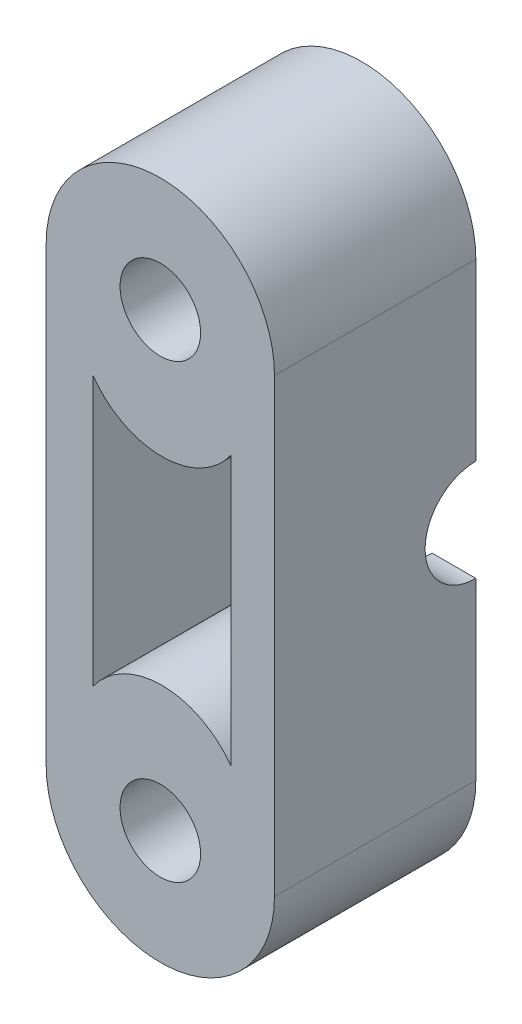
ISO-10303-21;
HEADER;
FILE_DESCRIPTION(('STEP AP214'),'2;1');
FILE_NAME('part.step','',(''),(''),'','','');
FILE_SCHEMA(('AUTOMOTIVE_DESIGN { 1 0 10303 214 1 1 1 1 }'));
ENDSEC;
DATA;
#1=APPLICATION_CONTEXT('core data for automotive mechanical design processes');
#2=APPLICATION_PROTOCOL_DEFINITION('international standard','automotive_design',2000,#1);
#3=PRODUCT_CONTEXT('',#1,'mechanical');
#4=PRODUCT('Part','Part','',(#3));
#5=PRODUCT_RELATED_PRODUCT_CATEGORY('part','',(#4));
#6=PRODUCT_DEFINITION_FORMATION('','',#4);
#7=PRODUCT_DEFINITION_CONTEXT('part definition',#1,'design');
#8=PRODUCT_DEFINITION('design','',#6,#7);
#9=PRODUCT_DEFINITION_SHAPE('','',#8);
#10=(LENGTH_UNIT() NAMED_UNIT(*) SI_UNIT(.MILLI.,.METRE.));
#11=(NAMED_UNIT(*) PLANE_ANGLE_UNIT() SI_UNIT($,.RADIAN.));
#12=(NAMED_UNIT(*) SI_UNIT($,.STERADIAN.) SOLID_ANGLE_UNIT());
#13=UNCERTAINTY_MEASURE_WITH_UNIT(LENGTH_MEASURE(1.E-05),#10,'distance_accuracy_value','');
#14=(GEOMETRIC_REPRESENTATION_CONTEXT(3) GLOBAL_UNCERTAINTY_ASSIGNED_CONTEXT((#13)) GLOBAL_UNIT_ASSIGNED_CONTEXT((#10,
#11,#12)) REPRESENTATION_CONTEXT('',''));
#15=CARTESIAN_POINT('',(0.,0.,0.));
#16=DIRECTION('',(0.,0.,1.));
#17=DIRECTION('',(1.,0.,0.));
#18=AXIS2_PLACEMENT_3D('',#15,#16,#17);
#19=CARTESIAN_POINT('',(-27.3715807741558,59.91651768647,5.));
#20=DIRECTION('',(0.,0.,-1.));
#21=DIRECTION('',(-1.,0.,0.));
#22=AXIS2_PLACEMENT_3D('',#19,#20,#21);
#23=CYLINDRICAL_SURFACE('',#22,1.);
#24=CARTESIAN_POINT('',(-27.3715807741558,59.91651768647,5.));
#25=DIRECTION('',(0.,0.,1.));
#26=DIRECTION('',(1.,0.,0.));
#27=AXIS2_PLACEMENT_3D('',#24,#25,#26);
#28=CIRCLE('',#27,1.);
#29=CARTESIAN_POINT('',(-26.3715807741558,59.91651768647,5.));
#30=VERTEX_POINT('',#29);
#31=EDGE_CURVE('E224',#30,#30,#28,.T.);
#32=ORIENTED_EDGE('',*,*,#31,.T.);
#33=EDGE_LOOP('',(#32));
#34=FACE_BOUND('',#33,.T.);
#35=CARTESIAN_POINT('',(-27.3715807741558,59.91651768647,3.));
#36=DIRECTION('',(0.,0.,-1.));
#37=DIRECTION('',(-1.,0.,0.));
#38=AXIS2_PLACEMENT_3D('',#35,#36,#37);
#39=CIRCLE('',#38,1.);
#40=CARTESIAN_POINT('',(-28.3715807741558,59.91651768647,3.));
#41=VERTEX_POINT('',#40);
#42=EDGE_CURVE('E37',#41,#41,#39,.T.);
#43=ORIENTED_EDGE('',*,*,#42,.T.);
#44=EDGE_LOOP('',(#43));
#45=FACE_BOUND('',#44,.T.);
#46=ADVANCED_FACE('F33',(#34,#45),#23,.F.);
#47=CARTESIAN_POINT('',(-27.3715807741558,71.1202505677841,5.));
#48=DIRECTION('',(0.,0.,-1.));
#49=DIRECTION('',(-1.,0.,0.));
#50=AXIS2_PLACEMENT_3D('',#47,#48,#49);
#51=CYLINDRICAL_SURFACE('',#50,1.00000000000001);
#52=CARTESIAN_POINT('',(-27.3715807741558,71.1202505677841,5.));
#53=DIRECTION('',(0.,0.,1.));
#54=DIRECTION('',(1.,0.,0.));
#55=AXIS2_PLACEMENT_3D('',#52,#53,#54);
#56=CIRCLE('',#55,1.00000000000001);
#57=CARTESIAN_POINT('',(-26.3715807741558,71.1202505677841,5.));
#58=VERTEX_POINT('',#57);
#59=EDGE_CURVE('E221',#58,#58,#56,.T.);
#60=ORIENTED_EDGE('',*,*,#59,.T.);
#61=EDGE_LOOP('',(#60));
#62=FACE_BOUND('',#61,.T.);
#63=CARTESIAN_POINT('',(-27.3715807741558,71.1202505677841,3.));
#64=DIRECTION('',(0.,0.,-1.));
#65=DIRECTION('',(-1.,0.,0.));
#66=AXIS2_PLACEMENT_3D('',#63,#64,#65);
#67=CIRCLE('',#66,1.00000000000001);
#68=CARTESIAN_POINT('',(-28.3715807741558,71.1202505677841,3.));
#69=VERTEX_POINT('',#68);
#70=EDGE_CURVE('E138',#69,#69,#67,.T.);
#71=ORIENTED_EDGE('',*,*,#70,.T.);
#72=EDGE_LOOP('',(#71));
#73=FACE_BOUND('',#72,.T.);
#74=ADVANCED_FACE('F275',(#62,#73),#51,.F.);
#75=CARTESIAN_POINT('',(-27.3715807741558,71.1202505677841,0.));
#76=DIRECTION('',(0.,0.,1.));
#77=DIRECTION('',(1.,0.,0.));
#78=AXIS2_PLACEMENT_3D('',#75,#76,#77);
#79=PLANE('',#78);
#80=CARTESIAN_POINT('',(-27.3715807741558,59.91651768647,0.));
#81=DIRECTION('',(0.,0.,-1.));
#82=DIRECTION('',(-1.,0.,0.));
#83=AXIS2_PLACEMENT_3D('',#80,#81,#82);
#84=CIRCLE('',#83,2.);
#85=CARTESIAN_POINT('',(-29.3715807741558,59.91651768647,0.));
#86=VERTEX_POINT('',#85);
#87=EDGE_CURVE('E282',#86,#86,#84,.T.);
#88=ORIENTED_EDGE('',*,*,#87,.F.);
#89=EDGE_LOOP('',(#88));
#90=FACE_BOUND('',#89,.T.);
#91=DIRECTION('',(0.,-1.,0.));
#92=VECTOR('',#91,1.);
#93=CARTESIAN_POINT('',(-30.2061787940453,71.1202505677841,0.));
#94=LINE('',#93,#92);
#95=CARTESIAN_POINT('',(-30.2061787940453,64.2584232711498,0.));
#96=VERTEX_POINT('',#95);
#97=CARTESIAN_POINT('',(-30.2061787940453,59.91651768647,0.));
#98=VERTEX_POINT('',#97);
#99=EDGE_CURVE('E227',#96,#98,#94,.T.);
#100=ORIENTED_EDGE('',*,*,#99,.F.);
#101=DIRECTION('',(1.,0.,0.));
#102=VECTOR('',#101,1.);
#103=CARTESIAN_POINT('',(-39.5369827542663,64.2584232711498,0.));
#104=LINE('',#103,#102);
#105=CARTESIAN_POINT('',(-29.0388809266111,64.2584232711498,0.));
#106=VERTEX_POINT('',#105);
#107=EDGE_CURVE('E182',#96,#106,#104,.T.);
#108=ORIENTED_EDGE('',*,*,#107,.T.);
#109=DIRECTION('',(0.,-1.,0.));
#110=VECTOR('',#109,1.);
#111=CARTESIAN_POINT('',(-29.0388809266111,68.8624014161277,0.));
#112=LINE('',#111,#110);
#113=CARTESIAN_POINT('',(-29.0388809266111,62.1904899484629,0.));
#114=VERTEX_POINT('',#113);
#115=EDGE_CURVE('E190',#106,#114,#112,.T.);
#116=ORIENTED_EDGE('',*,*,#115,.T.);
#117=CARTESIAN_POINT('',(-27.3302206726969,60.9530673439399,0.));
#118=DIRECTION('',(0.,0.,-1.));
#119=DIRECTION('',(-1.,0.,0.));
#120=AXIS2_PLACEMENT_3D('',#117,#118,#119);
#121=CIRCLE('',#120,2.1096764125075);
#122=CARTESIAN_POINT('',(-25.6215604187827,62.1904899484629,0.));
#123=VERTEX_POINT('',#122);
#124=EDGE_CURVE('E194',#114,#123,#121,.T.);
#125=ORIENTED_EDGE('',*,*,#124,.T.);
#126=DIRECTION('',(0.,1.,0.));
#127=VECTOR('',#126,1.);
#128=CARTESIAN_POINT('',(-25.6215604187827,68.8624014161277,0.));
#129=LINE('',#128,#127);
#130=CARTESIAN_POINT('',(-25.6215604187827,64.2584232711498,0.));
#131=VERTEX_POINT('',#130);
#132=EDGE_CURVE('E198',#123,#131,#129,.T.);
#133=ORIENTED_EDGE('',*,*,#132,.T.);
#134=CARTESIAN_POINT('',(-24.5369827542663,64.2584232711498,0.));
#135=VERTEX_POINT('',#134);
#136=EDGE_CURVE('E57',#131,#135,#104,.T.);
#137=ORIENTED_EDGE('',*,*,#136,.T.);
#138=DIRECTION('',(0.,1.,0.));
#139=VECTOR('',#138,1.);
#140=CARTESIAN_POINT('',(-24.5369827542663,71.1202505677841,0.));
#141=LINE('',#140,#139);
#142=CARTESIAN_POINT('',(-24.5369827542663,59.91651768647,0.));
#143=VERTEX_POINT('',#142);
#144=EDGE_CURVE('E137',#143,#135,#141,.T.);
#145=ORIENTED_EDGE('',*,*,#144,.F.);
#146=CARTESIAN_POINT('',(-27.3715807741558,59.91651768647,0.));
#147=DIRECTION('',(0.,0.,1.));
#148=DIRECTION('',(1.,0.,0.));
#149=AXIS2_PLACEMENT_3D('',#146,#147,#148);
#150=CIRCLE('',#149,2.83459801988952);
#151=EDGE_CURVE('E144',#98,#143,#150,.T.);
#152=ORIENTED_EDGE('',*,*,#151,.F.);
#153=EDGE_LOOP('',(#100,#108,#116,#125,#133,#137,#145,#152));
#154=FACE_BOUND('',#153,.T.);
#155=ADVANCED_FACE('F240',(#90,#154),#79,.F.);
#156=CARTESIAN_POINT('',(-27.3715807741558,71.1202505677841,5.));
#157=DIRECTION('',(0.,0.,1.));
#158=DIRECTION('',(1.,0.,0.));
#159=AXIS2_PLACEMENT_3D('',#156,#157,#158);
#160=PLANE('',#159);
#161=ORIENTED_EDGE('',*,*,#59,.F.);
#162=EDGE_LOOP('',(#161));
#163=FACE_BOUND('',#162,.T.);
#164=CARTESIAN_POINT('',(-27.3715807741558,71.1202505677841,5.));
#165=DIRECTION('',(0.,0.,1.));
#166=DIRECTION('',(1.,0.,0.));
#167=AXIS2_PLACEMENT_3D('',#164,#165,#166);
#168=CIRCLE('',#167,2.83459801988952);
#169=CARTESIAN_POINT('',(-24.5369827542663,71.1202505677841,5.));
#170=VERTEX_POINT('',#169);
#171=CARTESIAN_POINT('',(-30.2061787940453,71.1202505677841,5.));
#172=VERTEX_POINT('',#171);
#173=EDGE_CURVE('E146',#170,#172,#168,.T.);
#174=ORIENTED_EDGE('',*,*,#173,.T.);
#175=DIRECTION('',(0.,-1.,0.));
#176=VECTOR('',#175,1.);
#177=CARTESIAN_POINT('',(-30.2061787940453,71.1202505677841,5.));
#178=LINE('',#177,#176);
#179=CARTESIAN_POINT('',(-30.2061787940453,59.91651768647,5.));
#180=VERTEX_POINT('',#179);
#181=EDGE_CURVE('E153',#172,#180,#178,.T.);
#182=ORIENTED_EDGE('',*,*,#181,.T.);
#183=CARTESIAN_POINT('',(-27.3715807741558,59.91651768647,5.));
#184=DIRECTION('',(0.,0.,1.));
#185=DIRECTION('',(1.,0.,0.));
#186=AXIS2_PLACEMENT_3D('',#183,#184,#185);
#187=CIRCLE('',#186,2.83459801988952);
#188=CARTESIAN_POINT('',(-24.5369827542663,59.91651768647,5.));
#189=VERTEX_POINT('',#188);
#190=EDGE_CURVE('E155',#180,#189,#187,.T.);
#191=ORIENTED_EDGE('',*,*,#190,.T.);
#192=DIRECTION('',(0.,1.,0.));
#193=VECTOR('',#192,1.);
#194=CARTESIAN_POINT('',(-24.5369827542663,71.1202505677841,5.));
#195=LINE('',#194,#193);
#196=EDGE_CURVE('E157',#189,#170,#195,.T.);
#197=ORIENTED_EDGE('',*,*,#196,.T.);
#198=EDGE_LOOP('',(#174,#182,#191,#197));
#199=FACE_BOUND('',#198,.T.);
#200=ORIENTED_EDGE('',*,*,#31,.F.);
#201=EDGE_LOOP('',(#200));
#202=FACE_BOUND('',#201,.T.);
#203=DIRECTION('',(0.,-1.,0.));
#204=VECTOR('',#203,1.);
#205=CARTESIAN_POINT('',(-29.0388809266111,68.8624014161277,5.));
#206=LINE('',#205,#204);
#207=CARTESIAN_POINT('',(-29.0388809266111,68.8624014161277,5.));
#208=VERTEX_POINT('',#207);
#209=CARTESIAN_POINT('',(-29.0388809266111,62.1904899484629,5.));
#210=VERTEX_POINT('',#209);
#211=EDGE_CURVE('E203',#208,#210,#206,.T.);
#212=ORIENTED_EDGE('',*,*,#211,.F.);
#213=CARTESIAN_POINT('',(-27.3302206726969,70.0760926282352,5.));
#214=DIRECTION('',(0.,0.,-1.));
#215=DIRECTION('',(1.,0.,0.));
#216=AXIS2_PLACEMENT_3D('',#213,#214,#215);
#217=CIRCLE('',#216,2.09584498989144);
#218=CARTESIAN_POINT('',(-25.6215604187827,68.8624014161277,5.));
#219=VERTEX_POINT('',#218);
#220=EDGE_CURVE('E201',#219,#208,#217,.T.);
#221=ORIENTED_EDGE('',*,*,#220,.F.);
#222=DIRECTION('',(0.,1.,0.));
#223=VECTOR('',#222,1.);
#224=CARTESIAN_POINT('',(-25.6215604187827,68.8624014161277,5.));
#225=LINE('',#224,#223);
#226=CARTESIAN_POINT('',(-25.6215604187827,62.1904899484629,5.));
#227=VERTEX_POINT('',#226);
#228=EDGE_CURVE('E208',#227,#219,#225,.T.);
#229=ORIENTED_EDGE('',*,*,#228,.F.);
#230=CARTESIAN_POINT('',(-27.3302206726969,60.9530673439399,5.));
#231=DIRECTION('',(0.,0.,-1.));
#232=DIRECTION('',(-1.,0.,0.));
#233=AXIS2_PLACEMENT_3D('',#230,#231,#232);
#234=CIRCLE('',#233,2.1096764125075);
#235=EDGE_CURVE('E205',#210,#227,#234,.T.);
#236=ORIENTED_EDGE('',*,*,#235,.F.);
#237=EDGE_LOOP('',(#212,#221,#229,#236));
#238=FACE_BOUND('',#237,.T.);
#239=ADVANCED_FACE('F257',(#163,#199,#202,#238),#160,.T.);
#240=CARTESIAN_POINT('',(-27.3715807741558,71.1202505677829,0.));
#241=DIRECTION('',(0.,0.,-1.));
#242=DIRECTION('',(-1.,0.,0.));
#243=AXIS2_PLACEMENT_3D('',#240,#241,#242);
#244=CIRCLE('',#243,2.);
#245=CARTESIAN_POINT('',(-29.3715807741559,71.1202505677829,0.));
#246=VERTEX_POINT('',#245);
#247=EDGE_CURVE('E172',#246,#246,#244,.T.);
#248=ORIENTED_EDGE('',*,*,#247,.F.);
#249=EDGE_LOOP('',(#248));
#250=FACE_BOUND('',#249,.T.);
#251=CARTESIAN_POINT('',(-24.5369827542663,66.7783449831043,0.));
#252=VERTEX_POINT('',#251);
#253=CARTESIAN_POINT('',(-24.5369827542663,71.1202505677841,0.));
#254=VERTEX_POINT('',#253);
#255=EDGE_CURVE('E133',#252,#254,#141,.T.);
#256=ORIENTED_EDGE('',*,*,#255,.F.);
#257=DIRECTION('',(1.,0.,0.));
#258=VECTOR('',#257,1.);
#259=CARTESIAN_POINT('',(-39.5369827542663,66.7783449831043,0.));
#260=LINE('',#259,#258);
#261=CARTESIAN_POINT('',(-25.6215604187827,66.7783449831043,0.));
#262=VERTEX_POINT('',#261);
#263=EDGE_CURVE('E121',#252,#262,#260,.F.);
#264=ORIENTED_EDGE('',*,*,#263,.T.);
#265=CARTESIAN_POINT('',(-25.6215604187827,68.8624014161277,0.));
#266=VERTEX_POINT('',#265);
#267=EDGE_CURVE('E197',#262,#266,#129,.T.);
#268=ORIENTED_EDGE('',*,*,#267,.T.);
#269=CARTESIAN_POINT('',(-27.3302206726969,70.0760926282352,0.));
#270=DIRECTION('',(0.,0.,-1.));
#271=DIRECTION('',(1.,0.,0.));
#272=AXIS2_PLACEMENT_3D('',#269,#270,#271);
#273=CIRCLE('',#272,2.09584498989144);
#274=CARTESIAN_POINT('',(-29.0388809266111,68.8624014161277,0.));
#275=VERTEX_POINT('',#274);
#276=EDGE_CURVE('E187',#266,#275,#273,.T.);
#277=ORIENTED_EDGE('',*,*,#276,.T.);
#278=CARTESIAN_POINT('',(-29.0388809266111,66.7783449831043,0.));
#279=VERTEX_POINT('',#278);
#280=EDGE_CURVE('E191',#275,#279,#112,.T.);
#281=ORIENTED_EDGE('',*,*,#280,.T.);
#282=CARTESIAN_POINT('',(-30.2061787940453,66.7783449831043,0.));
#283=VERTEX_POINT('',#282);
#284=EDGE_CURVE('E50',#279,#283,#260,.F.);
#285=ORIENTED_EDGE('',*,*,#284,.T.);
#286=CARTESIAN_POINT('',(-30.2061787940453,71.1202505677841,0.));
#287=VERTEX_POINT('',#286);
#288=EDGE_CURVE('E147',#287,#283,#94,.T.);
#289=ORIENTED_EDGE('',*,*,#288,.F.);
#290=CARTESIAN_POINT('',(-27.3715807741558,71.1202505677841,0.));
#291=DIRECTION('',(0.,0.,1.));
#292=DIRECTION('',(1.,0.,0.));
#293=AXIS2_PLACEMENT_3D('',#290,#291,#292);
#294=CIRCLE('',#293,2.83459801988952);
#295=EDGE_CURVE('E143',#254,#287,#294,.T.);
#296=ORIENTED_EDGE('',*,*,#295,.F.);
#297=EDGE_LOOP('',(#256,#264,#268,#277,#281,#285,#289,#296));
#298=FACE_BOUND('',#297,.T.);
#299=ADVANCED_FACE('F141',(#250,#298),#79,.F.);
#300=CARTESIAN_POINT('',(-27.3715807741558,71.1202505677841,5.));
#301=DIRECTION('',(0.,0.,-1.));
#302=DIRECTION('',(-1.,0.,0.));
#303=AXIS2_PLACEMENT_3D('',#300,#301,#302);
#304=CYLINDRICAL_SURFACE('',#303,2.83459801988952);
#305=ORIENTED_EDGE('',*,*,#295,.T.);
#306=DIRECTION('',(0.,0.,-1.));
#307=VECTOR('',#306,1.);
#308=CARTESIAN_POINT('',(-30.2061787940453,71.1202505677841,5.));
#309=LINE('',#308,#307);
#310=EDGE_CURVE('E42',#172,#287,#309,.T.);
#311=ORIENTED_EDGE('',*,*,#310,.F.);
#312=ORIENTED_EDGE('',*,*,#173,.F.);
#313=DIRECTION('',(0.,0.,-1.));
#314=VECTOR('',#313,1.);
#315=CARTESIAN_POINT('',(-24.5369827542663,71.1202505677841,5.));
#316=LINE('',#315,#314);
#317=EDGE_CURVE('E159',#170,#254,#316,.T.);
#318=ORIENTED_EDGE('',*,*,#317,.T.);
#319=EDGE_LOOP('',(#305,#311,#312,#318));
#320=FACE_BOUND('',#319,.T.);
#321=ADVANCED_FACE('F35',(#320),#304,.T.);
#322=CARTESIAN_POINT('',(-30.2061787940453,71.1202505677841,5.));
#323=DIRECTION('',(1.,0.,0.));
#324=DIRECTION('',(0.,0.,-1.));
#325=AXIS2_PLACEMENT_3D('',#322,#323,#324);
#326=PLANE('',#325);
#327=ORIENTED_EDGE('',*,*,#288,.T.);
#328=CARTESIAN_POINT('',(-30.2061787940453,65.5183841271271,0.));
#329=DIRECTION('',(1.,0.,0.));
#330=DIRECTION('',(0.,0.,-1.));
#331=AXIS2_PLACEMENT_3D('',#328,#329,#330);
#332=CIRCLE('',#331,1.25996085597728);
#333=EDGE_CURVE('E184',#283,#96,#332,.T.);
#334=ORIENTED_EDGE('',*,*,#333,.T.);
#335=ORIENTED_EDGE('',*,*,#99,.T.);
#336=DIRECTION('',(0.,0.,-1.));
#337=VECTOR('',#336,1.);
#338=CARTESIAN_POINT('',(-30.2061787940453,59.91651768647,5.));
#339=LINE('',#338,#337);
#340=EDGE_CURVE('E163',#180,#98,#339,.T.);
#341=ORIENTED_EDGE('',*,*,#340,.F.);
#342=ORIENTED_EDGE('',*,*,#181,.F.);
#343=ORIENTED_EDGE('',*,*,#310,.T.);
#344=EDGE_LOOP('',(#327,#334,#335,#341,#342,#343));
#345=FACE_BOUND('',#344,.T.);
#346=ADVANCED_FACE('F232',(#345),#326,.F.);
#347=CARTESIAN_POINT('',(-27.3715807741558,59.91651768647,5.));
#348=DIRECTION('',(0.,0.,-1.));
#349=DIRECTION('',(-1.,0.,0.));
#350=AXIS2_PLACEMENT_3D('',#347,#348,#349);
#351=CYLINDRICAL_SURFACE('',#350,2.83459801988952);
#352=ORIENTED_EDGE('',*,*,#151,.T.);
#353=DIRECTION('',(0.,0.,-1.));
#354=VECTOR('',#353,1.);
#355=CARTESIAN_POINT('',(-24.5369827542663,59.91651768647,5.));
#356=LINE('',#355,#354);
#357=EDGE_CURVE('E161',#189,#143,#356,.T.);
#358=ORIENTED_EDGE('',*,*,#357,.F.);
#359=ORIENTED_EDGE('',*,*,#190,.F.);
#360=ORIENTED_EDGE('',*,*,#340,.T.);
#361=EDGE_LOOP('',(#352,#358,#359,#360));
#362=FACE_BOUND('',#361,.T.);
#363=ADVANCED_FACE('F238',(#362),#351,.T.);
#364=CARTESIAN_POINT('',(-24.5369827542663,71.1202505677841,5.));
#365=DIRECTION('',(-1.,0.,0.));
#366=DIRECTION('',(0.,0.,1.));
#367=AXIS2_PLACEMENT_3D('',#364,#365,#366);
#368=PLANE('',#367);
#369=ORIENTED_EDGE('',*,*,#144,.T.);
#370=CARTESIAN_POINT('',(-24.5369827542663,65.5183841271271,0.));
#371=DIRECTION('',(1.,0.,0.));
#372=DIRECTION('',(0.,0.,-1.));
#373=AXIS2_PLACEMENT_3D('',#370,#371,#372);
#374=CIRCLE('',#373,1.25996085597728);
#375=EDGE_CURVE('E124',#252,#135,#374,.T.);
#376=ORIENTED_EDGE('',*,*,#375,.F.);
#377=ORIENTED_EDGE('',*,*,#255,.T.);
#378=ORIENTED_EDGE('',*,*,#317,.F.);
#379=ORIENTED_EDGE('',*,*,#196,.F.);
#380=ORIENTED_EDGE('',*,*,#357,.T.);
#381=EDGE_LOOP('',(#369,#376,#377,#378,#379,#380));
#382=FACE_BOUND('',#381,.T.);
#383=ADVANCED_FACE('F131',(#382),#368,.F.);
#384=CARTESIAN_POINT('',(-27.3302206726969,70.0760926282352,5.));
#385=DIRECTION('',(0.,0.,-1.));
#386=DIRECTION('',(-1.,0.,0.));
#387=AXIS2_PLACEMENT_3D('',#384,#385,#386);
#388=CYLINDRICAL_SURFACE('',#387,2.09584498989144);
#389=ORIENTED_EDGE('',*,*,#276,.F.);
#390=DIRECTION('',(0.,0.,-1.));
#391=VECTOR('',#390,1.);
#392=CARTESIAN_POINT('',(-25.6215604187827,68.8624014161277,5.));
#393=LINE('',#392,#391);
#394=EDGE_CURVE('E210',#219,#266,#393,.T.);
#395=ORIENTED_EDGE('',*,*,#394,.F.);
#396=ORIENTED_EDGE('',*,*,#220,.T.);
#397=DIRECTION('',(0.,0.,-1.));
#398=VECTOR('',#397,1.);
#399=CARTESIAN_POINT('',(-29.0388809266111,68.8624014161277,5.));
#400=LINE('',#399,#398);
#401=EDGE_CURVE('E218',#208,#275,#400,.T.);
#402=ORIENTED_EDGE('',*,*,#401,.T.);
#403=EDGE_LOOP('',(#389,#395,#396,#402));
#404=FACE_BOUND('',#403,.T.);
#405=ADVANCED_FACE('F248',(#404),#388,.T.);
#406=CARTESIAN_POINT('',(-29.0388809266111,68.8624014161277,5.));
#407=DIRECTION('',(1.,0.,0.));
#408=DIRECTION('',(0.,0.,-1.));
#409=AXIS2_PLACEMENT_3D('',#406,#407,#408);
#410=PLANE('',#409);
#411=CARTESIAN_POINT('',(-29.0388809266111,65.5183841271271,0.));
#412=DIRECTION('',(1.,0.,0.));
#413=DIRECTION('',(0.,0.,-1.));
#414=AXIS2_PLACEMENT_3D('',#411,#412,#413);
#415=CIRCLE('',#414,1.25996085597728);
#416=EDGE_CURVE('E181',#279,#106,#415,.T.);
#417=ORIENTED_EDGE('',*,*,#416,.F.);
#418=ORIENTED_EDGE('',*,*,#280,.F.);
#419=ORIENTED_EDGE('',*,*,#401,.F.);
#420=ORIENTED_EDGE('',*,*,#211,.T.);
#421=DIRECTION('',(0.,0.,-1.));
#422=VECTOR('',#421,1.);
#423=CARTESIAN_POINT('',(-29.0388809266111,62.1904899484629,5.));
#424=LINE('',#423,#422);
#425=EDGE_CURVE('E215',#210,#114,#424,.T.);
#426=ORIENTED_EDGE('',*,*,#425,.T.);
#427=ORIENTED_EDGE('',*,*,#115,.F.);
#428=EDGE_LOOP('',(#417,#418,#419,#420,#426,#427));
#429=FACE_BOUND('',#428,.T.);
#430=ADVANCED_FACE('F253',(#429),#410,.T.);
#431=CARTESIAN_POINT('',(-27.3302206726969,60.9530673439399,5.));
#432=DIRECTION('',(0.,0.,-1.));
#433=DIRECTION('',(-1.,0.,0.));
#434=AXIS2_PLACEMENT_3D('',#431,#432,#433);
#435=CYLINDRICAL_SURFACE('',#434,2.1096764125075);
#436=ORIENTED_EDGE('',*,*,#124,.F.);
#437=ORIENTED_EDGE('',*,*,#425,.F.);
#438=ORIENTED_EDGE('',*,*,#235,.T.);
#439=DIRECTION('',(0.,0.,-1.));
#440=VECTOR('',#439,1.);
#441=CARTESIAN_POINT('',(-25.6215604187827,62.1904899484629,5.));
#442=LINE('',#441,#440);
#443=EDGE_CURVE('E213',#227,#123,#442,.T.);
#444=ORIENTED_EDGE('',*,*,#443,.T.);
#445=EDGE_LOOP('',(#436,#437,#438,#444));
#446=FACE_BOUND('',#445,.T.);
#447=ADVANCED_FACE('F260',(#446),#435,.T.);
#448=CARTESIAN_POINT('',(-25.6215604187827,68.8624014161277,5.));
#449=DIRECTION('',(-1.,0.,0.));
#450=DIRECTION('',(0.,0.,1.));
#451=AXIS2_PLACEMENT_3D('',#448,#449,#450);
#452=PLANE('',#451);
#453=CARTESIAN_POINT('',(-25.6215604187827,65.5183841271271,0.));
#454=DIRECTION('',(-1.,0.,0.));
#455=DIRECTION('',(0.,0.,1.));
#456=AXIS2_PLACEMENT_3D('',#453,#454,#455);
#457=CIRCLE('',#456,1.25996085597728);
#458=EDGE_CURVE('E11',#131,#262,#457,.T.);
#459=ORIENTED_EDGE('',*,*,#458,.F.);
#460=ORIENTED_EDGE('',*,*,#132,.F.);
#461=ORIENTED_EDGE('',*,*,#443,.F.);
#462=ORIENTED_EDGE('',*,*,#228,.T.);
#463=ORIENTED_EDGE('',*,*,#394,.T.);
#464=ORIENTED_EDGE('',*,*,#267,.F.);
#465=EDGE_LOOP('',(#459,#460,#461,#462,#463,#464));
#466=FACE_BOUND('',#465,.T.);
#467=ADVANCED_FACE('F244',(#466),#452,.T.);
#468=CARTESIAN_POINT('',(-39.5369827542663,65.5183841271271,0.));
#469=DIRECTION('',(1.,0.,0.));
#470=DIRECTION('',(0.,0.,-1.));
#471=AXIS2_PLACEMENT_3D('',#468,#469,#470);
#472=CYLINDRICAL_SURFACE('',#471,1.25996085597728);
#473=ORIENTED_EDGE('',*,*,#458,.T.);
#474=ORIENTED_EDGE('',*,*,#263,.F.);
#475=ORIENTED_EDGE('',*,*,#375,.T.);
#476=ORIENTED_EDGE('',*,*,#136,.F.);
#477=EDGE_LOOP('',(#473,#474,#475,#476));
#478=FACE_BOUND('',#477,.T.);
#479=ADVANCED_FACE('F123',(#478),#472,.F.);
#480=ORIENTED_EDGE('',*,*,#284,.F.);
#481=ORIENTED_EDGE('',*,*,#416,.T.);
#482=ORIENTED_EDGE('',*,*,#107,.F.);
#483=ORIENTED_EDGE('',*,*,#333,.F.);
#484=EDGE_LOOP('',(#480,#481,#482,#483));
#485=FACE_BOUND('',#484,.T.);
#486=ADVANCED_FACE('F308',(#485),#472,.F.);
#487=CARTESIAN_POINT('',(-27.3715807741558,71.1202505677829,3.));
#488=DIRECTION('',(0.,0.,-1.));
#489=DIRECTION('',(-1.,0.,0.));
#490=AXIS2_PLACEMENT_3D('',#487,#488,#489);
#491=CYLINDRICAL_SURFACE('',#490,2.);
#492=CARTESIAN_POINT('',(-27.3715807741558,71.1202505677829,3.));
#493=DIRECTION('',(0.,0.,-1.));
#494=DIRECTION('',(-1.,0.,0.));
#495=AXIS2_PLACEMENT_3D('',#492,#493,#494);
#496=CIRCLE('',#495,2.);
#497=CARTESIAN_POINT('',(-29.3715807741559,71.1202505677829,3.));
#498=VERTEX_POINT('',#497);
#499=EDGE_CURVE('E168',#498,#498,#496,.T.);
#500=ORIENTED_EDGE('',*,*,#499,.F.);
#501=EDGE_LOOP('',(#500));
#502=FACE_BOUND('',#501,.T.);
#503=ORIENTED_EDGE('',*,*,#247,.T.);
#504=EDGE_LOOP('',(#503));
#505=FACE_BOUND('',#504,.T.);
#506=ADVANCED_FACE('F305',(#502,#505),#491,.F.);
#507=CARTESIAN_POINT('',(-27.3715807741558,71.1202505677829,3.));
#508=DIRECTION('',(0.,0.,-1.));
#509=DIRECTION('',(-1.,0.,0.));
#510=AXIS2_PLACEMENT_3D('',#507,#508,#509);
#511=PLANE('',#510);
#512=ORIENTED_EDGE('',*,*,#70,.F.);
#513=EDGE_LOOP('',(#512));
#514=FACE_BOUND('',#513,.T.);
#515=ORIENTED_EDGE('',*,*,#499,.T.);
#516=EDGE_LOOP('',(#515));
#517=FACE_BOUND('',#516,.T.);
#518=ADVANCED_FACE('F307',(#514,#517),#511,.T.);
#519=CARTESIAN_POINT('',(-27.3715807741558,59.91651768647,3.));
#520=DIRECTION('',(0.,0.,-1.));
#521=DIRECTION('',(-1.,0.,0.));
#522=AXIS2_PLACEMENT_3D('',#519,#520,#521);
#523=CYLINDRICAL_SURFACE('',#522,2.);
#524=CARTESIAN_POINT('',(-27.3715807741558,59.91651768647,3.));
#525=DIRECTION('',(0.,0.,-1.));
#526=DIRECTION('',(-1.,0.,0.));
#527=AXIS2_PLACEMENT_3D('',#524,#525,#526);
#528=CIRCLE('',#527,2.);
#529=CARTESIAN_POINT('',(-29.3715807741558,59.91651768647,3.));
#530=VERTEX_POINT('',#529);
#531=EDGE_CURVE('E280',#530,#530,#528,.T.);
#532=ORIENTED_EDGE('',*,*,#531,.F.);
#533=EDGE_LOOP('',(#532));
#534=FACE_BOUND('',#533,.T.);
#535=ORIENTED_EDGE('',*,*,#87,.T.);
#536=EDGE_LOOP('',(#535));
#537=FACE_BOUND('',#536,.T.);
#538=ADVANCED_FACE('F289',(#534,#537),#523,.F.);
#539=CARTESIAN_POINT('',(-27.3715807741558,59.91651768647,3.));
#540=DIRECTION('',(0.,0.,-1.));
#541=DIRECTION('',(-1.,0.,0.));
#542=AXIS2_PLACEMENT_3D('',#539,#540,#541);
#543=PLANE('',#542);
#544=ORIENTED_EDGE('',*,*,#42,.F.);
#545=EDGE_LOOP('',(#544));
#546=FACE_BOUND('',#545,.T.);
#547=ORIENTED_EDGE('',*,*,#531,.T.);
#548=EDGE_LOOP('',(#547));
#549=FACE_BOUND('',#548,.T.);
#550=ADVANCED_FACE('F416',(#546,#549),#543,.T.);
#551=CLOSED_SHELL('',(#46,#74,#155,#239,#299,#321,#346,#363,#383,#405,#430,#447,#467,#479,#486,
#506,#518,#538,#550));
#552=MANIFOLD_SOLID_BREP('B2',#551);
#553=ADVANCED_BREP_SHAPE_REPRESENTATION('',(#18,#552),#14);
#554=SHAPE_DEFINITION_REPRESENTATION(#9,#553);
ENDSEC;
END-ISO-10303-21;
